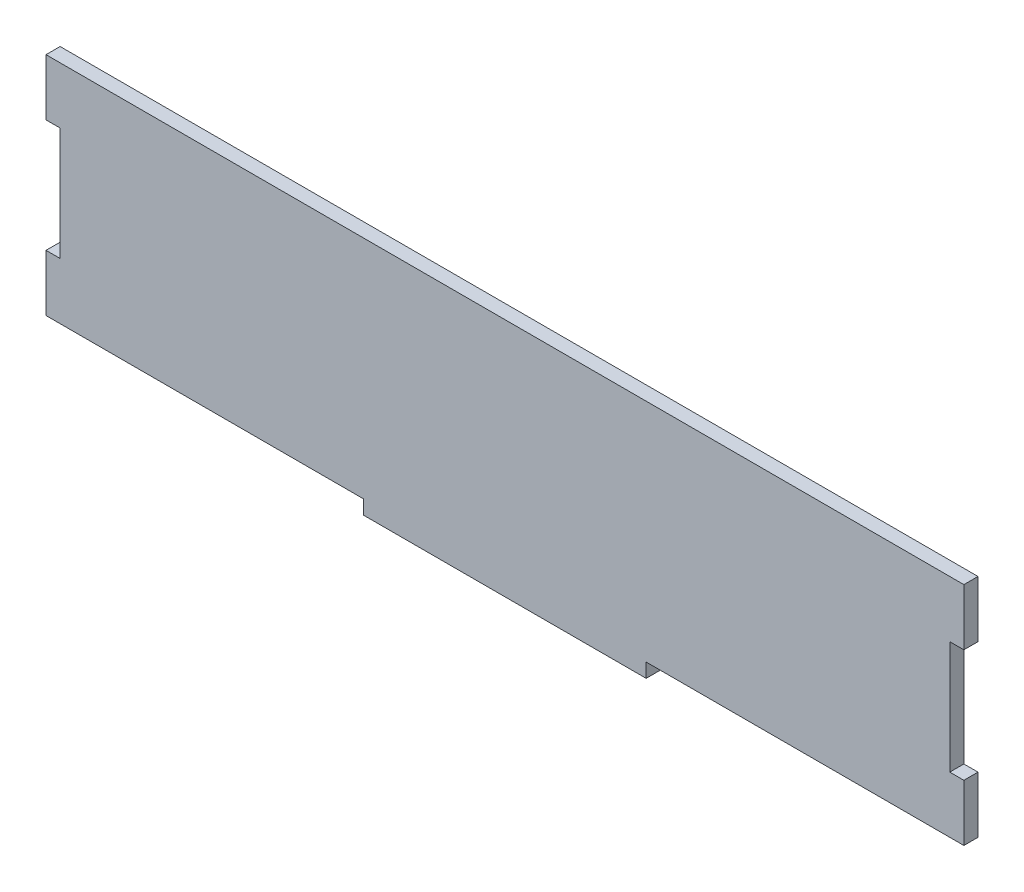
ISO-10303-21;
HEADER;
FILE_DESCRIPTION(('STEP AP214'),'2;1');
FILE_NAME('part.step','',(''),(''),'','','');
FILE_SCHEMA(('AUTOMOTIVE_DESIGN { 1 0 10303 214 1 1 1 1 }'));
ENDSEC;
DATA;
#1=APPLICATION_CONTEXT('core data for automotive mechanical design processes');
#2=APPLICATION_PROTOCOL_DEFINITION('international standard','automotive_design',2000,#1);
#3=PRODUCT_CONTEXT('',#1,'mechanical');
#4=PRODUCT('Part','Part','',(#3));
#5=PRODUCT_RELATED_PRODUCT_CATEGORY('part','',(#4));
#6=PRODUCT_DEFINITION_FORMATION('','',#4);
#7=PRODUCT_DEFINITION_CONTEXT('part definition',#1,'design');
#8=PRODUCT_DEFINITION('design','',#6,#7);
#9=PRODUCT_DEFINITION_SHAPE('','',#8);
#10=(LENGTH_UNIT() NAMED_UNIT(*) SI_UNIT(.MILLI.,.METRE.));
#11=(NAMED_UNIT(*) PLANE_ANGLE_UNIT() SI_UNIT($,.RADIAN.));
#12=(NAMED_UNIT(*) SI_UNIT($,.STERADIAN.) SOLID_ANGLE_UNIT());
#13=UNCERTAINTY_MEASURE_WITH_UNIT(LENGTH_MEASURE(1.E-05),#10,'distance_accuracy_value','');
#14=(GEOMETRIC_REPRESENTATION_CONTEXT(3) GLOBAL_UNCERTAINTY_ASSIGNED_CONTEXT((#13)) GLOBAL_UNIT_ASSIGNED_CONTEXT((#10,
#11,#12)) REPRESENTATION_CONTEXT('',''));
#15=CARTESIAN_POINT('',(0.,0.,0.));
#16=DIRECTION('',(0.,0.,1.));
#17=DIRECTION('',(1.,0.,0.));
#18=AXIS2_PLACEMENT_3D('',#15,#16,#17);
#19=CARTESIAN_POINT('',(0.,0.,5.));
#20=DIRECTION('',(1.,0.,0.));
#21=DIRECTION('',(0.,0.,-1.));
#22=AXIS2_PLACEMENT_3D('',#19,#20,#21);
#23=PLANE('',#22);
#24=DIRECTION('',(0.,-1.,0.));
#25=VECTOR('',#24,1.);
#26=CARTESIAN_POINT('',(0.,0.,5.));
#27=LINE('',#26,#25);
#28=CARTESIAN_POINT('',(0.,20.,5.));
#29=VERTEX_POINT('',#28);
#30=CARTESIAN_POINT('',(0.,0.,5.));
#31=VERTEX_POINT('',#30);
#32=EDGE_CURVE('E235',#29,#31,#27,.T.);
#33=ORIENTED_EDGE('',*,*,#32,.F.);
#34=DIRECTION('',(0.,0.,1.));
#35=VECTOR('',#34,1.);
#36=CARTESIAN_POINT('',(0.,20.,0.));
#37=LINE('',#36,#35);
#38=CARTESIAN_POINT('',(0.,20.,0.));
#39=VERTEX_POINT('',#38);
#40=EDGE_CURVE('E176',#39,#29,#37,.T.);
#41=ORIENTED_EDGE('',*,*,#40,.F.);
#42=DIRECTION('',(0.,-1.,0.));
#43=VECTOR('',#42,1.);
#44=CARTESIAN_POINT('',(0.,0.,0.));
#45=LINE('',#44,#43);
#46=CARTESIAN_POINT('',(0.,0.,0.));
#47=VERTEX_POINT('',#46);
#48=EDGE_CURVE('E166',#39,#47,#45,.T.);
#49=ORIENTED_EDGE('',*,*,#48,.T.);
#50=DIRECTION('',(0.,0.,-1.));
#51=VECTOR('',#50,1.);
#52=CARTESIAN_POINT('',(0.,0.,5.));
#53=LINE('',#52,#51);
#54=EDGE_CURVE('E11',#31,#47,#53,.T.);
#55=ORIENTED_EDGE('',*,*,#54,.F.);
#56=EDGE_LOOP('',(#33,#41,#49,#55));
#57=FACE_BOUND('',#56,.T.);
#58=ADVANCED_FACE('F33',(#57),#23,.F.);
#59=CARTESIAN_POINT('',(325.,0.,5.));
#60=DIRECTION('',(-1.,0.,0.));
#61=DIRECTION('',(0.,0.,1.));
#62=AXIS2_PLACEMENT_3D('',#59,#60,#61);
#63=PLANE('',#62);
#64=DIRECTION('',(0.,1.,0.));
#65=VECTOR('',#64,1.);
#66=CARTESIAN_POINT('',(325.,0.,0.));
#67=LINE('',#66,#65);
#68=CARTESIAN_POINT('',(325.,0.,0.));
#69=VERTEX_POINT('',#68);
#70=CARTESIAN_POINT('',(325.,20.,0.));
#71=VERTEX_POINT('',#70);
#72=EDGE_CURVE('E254',#69,#71,#67,.T.);
#73=ORIENTED_EDGE('',*,*,#72,.T.);
#74=DIRECTION('',(0.,0.,1.));
#75=VECTOR('',#74,1.);
#76=CARTESIAN_POINT('',(325.,20.,0.));
#77=LINE('',#76,#75);
#78=CARTESIAN_POINT('',(325.,20.,5.));
#79=VERTEX_POINT('',#78);
#80=EDGE_CURVE('E174',#71,#79,#77,.T.);
#81=ORIENTED_EDGE('',*,*,#80,.T.);
#82=DIRECTION('',(0.,1.,0.));
#83=VECTOR('',#82,1.);
#84=CARTESIAN_POINT('',(325.,0.,5.));
#85=LINE('',#84,#83);
#86=CARTESIAN_POINT('',(325.,0.,5.));
#87=VERTEX_POINT('',#86);
#88=EDGE_CURVE('E240',#87,#79,#85,.T.);
#89=ORIENTED_EDGE('',*,*,#88,.F.);
#90=DIRECTION('',(0.,0.,-1.));
#91=VECTOR('',#90,1.);
#92=CARTESIAN_POINT('',(325.,0.,5.));
#93=LINE('',#92,#91);
#94=EDGE_CURVE('E41',#87,#69,#93,.T.);
#95=ORIENTED_EDGE('',*,*,#94,.T.);
#96=EDGE_LOOP('',(#73,#81,#89,#95));
#97=FACE_BOUND('',#96,.T.);
#98=ADVANCED_FACE('F268',(#97),#63,.F.);
#99=CARTESIAN_POINT('',(0.,0.,5.));
#100=DIRECTION('',(0.,1.,0.));
#101=DIRECTION('',(0.,0.,1.));
#102=AXIS2_PLACEMENT_3D('',#99,#100,#101);
#103=PLANE('',#102);
#104=DIRECTION('',(0.,0.,1.));
#105=VECTOR('',#104,1.);
#106=CARTESIAN_POINT('',(212.5,0.,0.));
#107=LINE('',#106,#105);
#108=CARTESIAN_POINT('',(212.5,0.,0.));
#109=VERTEX_POINT('',#108);
#110=CARTESIAN_POINT('',(212.5,0.,5.));
#111=VERTEX_POINT('',#110);
#112=EDGE_CURVE('E215',#109,#111,#107,.T.);
#113=ORIENTED_EDGE('',*,*,#112,.F.);
#114=DIRECTION('',(1.,0.,0.));
#115=VECTOR('',#114,1.);
#116=CARTESIAN_POINT('',(0.,0.,0.));
#117=LINE('',#116,#115);
#118=EDGE_CURVE('E249',#109,#69,#117,.T.);
#119=ORIENTED_EDGE('',*,*,#118,.T.);
#120=ORIENTED_EDGE('',*,*,#94,.F.);
#121=DIRECTION('',(1.,0.,0.));
#122=VECTOR('',#121,1.);
#123=CARTESIAN_POINT('',(0.,0.,5.));
#124=LINE('',#123,#122);
#125=EDGE_CURVE('E234',#111,#87,#124,.T.);
#126=ORIENTED_EDGE('',*,*,#125,.F.);
#127=EDGE_LOOP('',(#113,#119,#120,#126));
#128=FACE_BOUND('',#127,.T.);
#129=ADVANCED_FACE('F282',(#128),#103,.F.);
#130=CARTESIAN_POINT('',(0.,80.,0.));
#131=VERTEX_POINT('',#130);
#132=CARTESIAN_POINT('',(0.,60.,0.));
#133=VERTEX_POINT('',#132);
#134=EDGE_CURVE('E246',#131,#133,#45,.T.);
#135=ORIENTED_EDGE('',*,*,#134,.T.);
#136=DIRECTION('',(0.,0.,1.));
#137=VECTOR('',#136,1.);
#138=CARTESIAN_POINT('',(0.,60.,0.));
#139=LINE('',#138,#137);
#140=CARTESIAN_POINT('',(0.,60.,5.));
#141=VERTEX_POINT('',#140);
#142=EDGE_CURVE('E179',#133,#141,#139,.T.);
#143=ORIENTED_EDGE('',*,*,#142,.T.);
#144=CARTESIAN_POINT('',(0.,80.,5.));
#145=VERTEX_POINT('',#144);
#146=EDGE_CURVE('E231',#145,#141,#27,.T.);
#147=ORIENTED_EDGE('',*,*,#146,.F.);
#148=DIRECTION('',(0.,0.,-1.));
#149=VECTOR('',#148,1.);
#150=CARTESIAN_POINT('',(0.,80.,5.));
#151=LINE('',#150,#149);
#152=EDGE_CURVE('E245',#145,#131,#151,.T.);
#153=ORIENTED_EDGE('',*,*,#152,.T.);
#154=EDGE_LOOP('',(#135,#143,#147,#153));
#155=FACE_BOUND('',#154,.T.);
#156=ADVANCED_FACE('F35',(#155),#23,.F.);
#157=CARTESIAN_POINT('',(112.5,0.,0.));
#158=VERTEX_POINT('',#157);
#159=EDGE_CURVE('E250',#47,#158,#117,.T.);
#160=ORIENTED_EDGE('',*,*,#159,.T.);
#161=DIRECTION('',(0.,0.,1.));
#162=VECTOR('',#161,1.);
#163=CARTESIAN_POINT('',(112.5,0.,0.));
#164=LINE('',#163,#162);
#165=CARTESIAN_POINT('',(112.5,0.,5.));
#166=VERTEX_POINT('',#165);
#167=EDGE_CURVE('E227',#158,#166,#164,.T.);
#168=ORIENTED_EDGE('',*,*,#167,.T.);
#169=EDGE_CURVE('E236',#31,#166,#124,.T.);
#170=ORIENTED_EDGE('',*,*,#169,.F.);
#171=ORIENTED_EDGE('',*,*,#54,.T.);
#172=EDGE_LOOP('',(#160,#168,#170,#171));
#173=FACE_BOUND('',#172,.T.);
#174=ADVANCED_FACE('F293',(#173),#103,.F.);
#175=CARTESIAN_POINT('',(325.,60.,5.));
#176=VERTEX_POINT('',#175);
#177=CARTESIAN_POINT('',(325.,80.,5.));
#178=VERTEX_POINT('',#177);
#179=EDGE_CURVE('E239',#176,#178,#85,.T.);
#180=ORIENTED_EDGE('',*,*,#179,.F.);
#181=DIRECTION('',(0.,0.,1.));
#182=VECTOR('',#181,1.);
#183=CARTESIAN_POINT('',(325.,60.,0.));
#184=LINE('',#183,#182);
#185=CARTESIAN_POINT('',(325.,60.,0.));
#186=VERTEX_POINT('',#185);
#187=EDGE_CURVE('E191',#186,#176,#184,.T.);
#188=ORIENTED_EDGE('',*,*,#187,.F.);
#189=CARTESIAN_POINT('',(325.,80.,0.));
#190=VERTEX_POINT('',#189);
#191=EDGE_CURVE('E253',#186,#190,#67,.T.);
#192=ORIENTED_EDGE('',*,*,#191,.T.);
#193=DIRECTION('',(0.,0.,-1.));
#194=VECTOR('',#193,1.);
#195=CARTESIAN_POINT('',(325.,80.,5.));
#196=LINE('',#195,#194);
#197=EDGE_CURVE('E261',#178,#190,#196,.T.);
#198=ORIENTED_EDGE('',*,*,#197,.F.);
#199=EDGE_LOOP('',(#180,#188,#192,#198));
#200=FACE_BOUND('',#199,.T.);
#201=ADVANCED_FACE('F312',(#200),#63,.F.);
#202=CARTESIAN_POINT('',(0.,80.,5.));
#203=DIRECTION('',(0.,-1.,0.));
#204=DIRECTION('',(0.,0.,-1.));
#205=AXIS2_PLACEMENT_3D('',#202,#203,#204);
#206=PLANE('',#205);
#207=DIRECTION('',(-1.,0.,0.));
#208=VECTOR('',#207,1.);
#209=CARTESIAN_POINT('',(0.,80.,0.));
#210=LINE('',#209,#208);
#211=EDGE_CURVE('E257',#190,#131,#210,.T.);
#212=ORIENTED_EDGE('',*,*,#211,.T.);
#213=ORIENTED_EDGE('',*,*,#152,.F.);
#214=DIRECTION('',(-1.,0.,0.));
#215=VECTOR('',#214,1.);
#216=CARTESIAN_POINT('',(0.,80.,5.));
#217=LINE('',#216,#215);
#218=EDGE_CURVE('E243',#178,#145,#217,.T.);
#219=ORIENTED_EDGE('',*,*,#218,.F.);
#220=ORIENTED_EDGE('',*,*,#197,.T.);
#221=EDGE_LOOP('',(#212,#213,#219,#220));
#222=FACE_BOUND('',#221,.T.);
#223=ADVANCED_FACE('F307',(#222),#206,.F.);
#224=CARTESIAN_POINT('',(0.,0.,5.));
#225=DIRECTION('',(0.,0.,-1.));
#226=DIRECTION('',(-1.,0.,0.));
#227=AXIS2_PLACEMENT_3D('',#224,#225,#226);
#228=PLANE('',#227);
#229=DIRECTION('',(0.,1.,0.));
#230=VECTOR('',#229,1.);
#231=CARTESIAN_POINT('',(4.99999999999999,60.,5.));
#232=LINE('',#231,#230);
#233=CARTESIAN_POINT('',(5.,20.,5.));
#234=VERTEX_POINT('',#233);
#235=CARTESIAN_POINT('',(4.99999999999999,60.,5.));
#236=VERTEX_POINT('',#235);
#237=EDGE_CURVE('E169',#234,#236,#232,.T.);
#238=ORIENTED_EDGE('',*,*,#237,.F.);
#239=DIRECTION('',(1.,0.,0.));
#240=VECTOR('',#239,1.);
#241=CARTESIAN_POINT('',(0.,20.,5.));
#242=LINE('',#241,#240);
#243=EDGE_CURVE('E152',#29,#234,#242,.T.);
#244=ORIENTED_EDGE('',*,*,#243,.F.);
#245=ORIENTED_EDGE('',*,*,#32,.T.);
#246=ORIENTED_EDGE('',*,*,#169,.T.);
#247=DIRECTION('',(0.,-1.,0.));
#248=VECTOR('',#247,1.);
#249=CARTESIAN_POINT('',(112.5,0.,5.));
#250=LINE('',#249,#248);
#251=CARTESIAN_POINT('',(112.5,-4.99999999999999,5.));
#252=VERTEX_POINT('',#251);
#253=EDGE_CURVE('E218',#166,#252,#250,.T.);
#254=ORIENTED_EDGE('',*,*,#253,.T.);
#255=DIRECTION('',(1.,0.,0.));
#256=VECTOR('',#255,1.);
#257=CARTESIAN_POINT('',(112.5,-4.99999999999999,5.));
#258=LINE('',#257,#256);
#259=CARTESIAN_POINT('',(212.5,-4.99999999999998,5.));
#260=VERTEX_POINT('',#259);
#261=EDGE_CURVE('E209',#252,#260,#258,.T.);
#262=ORIENTED_EDGE('',*,*,#261,.T.);
#263=DIRECTION('',(0.,1.,0.));
#264=VECTOR('',#263,1.);
#265=CARTESIAN_POINT('',(212.5,0.,5.));
#266=LINE('',#265,#264);
#267=EDGE_CURVE('E178',#260,#111,#266,.T.);
#268=ORIENTED_EDGE('',*,*,#267,.T.);
#269=ORIENTED_EDGE('',*,*,#125,.T.);
#270=ORIENTED_EDGE('',*,*,#88,.T.);
#271=DIRECTION('',(1.,0.,0.));
#272=VECTOR('',#271,1.);
#273=CARTESIAN_POINT('',(325.,20.,5.));
#274=LINE('',#273,#272);
#275=CARTESIAN_POINT('',(320.,20.,5.));
#276=VERTEX_POINT('',#275);
#277=EDGE_CURVE('E186',#276,#79,#274,.T.);
#278=ORIENTED_EDGE('',*,*,#277,.F.);
#279=DIRECTION('',(0.,-1.,0.));
#280=VECTOR('',#279,1.);
#281=CARTESIAN_POINT('',(320.,60.,5.));
#282=LINE('',#281,#280);
#283=CARTESIAN_POINT('',(320.,60.,5.));
#284=VERTEX_POINT('',#283);
#285=EDGE_CURVE('E195',#284,#276,#282,.T.);
#286=ORIENTED_EDGE('',*,*,#285,.F.);
#287=DIRECTION('',(-1.,0.,0.));
#288=VECTOR('',#287,1.);
#289=CARTESIAN_POINT('',(325.,60.,5.));
#290=LINE('',#289,#288);
#291=EDGE_CURVE('E192',#176,#284,#290,.T.);
#292=ORIENTED_EDGE('',*,*,#291,.F.);
#293=ORIENTED_EDGE('',*,*,#179,.T.);
#294=ORIENTED_EDGE('',*,*,#218,.T.);
#295=ORIENTED_EDGE('',*,*,#146,.T.);
#296=DIRECTION('',(-1.,0.,0.));
#297=VECTOR('',#296,1.);
#298=CARTESIAN_POINT('',(0.,60.,5.));
#299=LINE('',#298,#297);
#300=EDGE_CURVE('E167',#236,#141,#299,.T.);
#301=ORIENTED_EDGE('',*,*,#300,.F.);
#302=EDGE_LOOP('',(#238,#244,#245,#246,#254,#262,#268,#269,#270,#278,#286,#292,#293,#294,#295,#301));
#303=FACE_BOUND('',#302,.T.);
#304=ADVANCED_FACE('F278',(#303),#228,.F.);
#305=CARTESIAN_POINT('',(0.,0.,0.));
#306=DIRECTION('',(0.,0.,-1.));
#307=DIRECTION('',(-1.,0.,0.));
#308=AXIS2_PLACEMENT_3D('',#305,#306,#307);
#309=PLANE('',#308);
#310=DIRECTION('',(1.,0.,0.));
#311=VECTOR('',#310,1.);
#312=CARTESIAN_POINT('',(0.,20.,0.));
#313=LINE('',#312,#311);
#314=CARTESIAN_POINT('',(5.,20.,0.));
#315=VERTEX_POINT('',#314);
#316=EDGE_CURVE('E149',#39,#315,#313,.T.);
#317=ORIENTED_EDGE('',*,*,#316,.T.);
#318=DIRECTION('',(0.,1.,0.));
#319=VECTOR('',#318,1.);
#320=CARTESIAN_POINT('',(4.99999999999999,60.,0.));
#321=LINE('',#320,#319);
#322=CARTESIAN_POINT('',(4.99999999999999,60.,0.));
#323=VERTEX_POINT('',#322);
#324=EDGE_CURVE('E159',#315,#323,#321,.T.);
#325=ORIENTED_EDGE('',*,*,#324,.T.);
#326=DIRECTION('',(-1.,0.,0.));
#327=VECTOR('',#326,1.);
#328=CARTESIAN_POINT('',(0.,60.,0.));
#329=LINE('',#328,#327);
#330=EDGE_CURVE('E48',#323,#133,#329,.T.);
#331=ORIENTED_EDGE('',*,*,#330,.T.);
#332=ORIENTED_EDGE('',*,*,#134,.F.);
#333=ORIENTED_EDGE('',*,*,#211,.F.);
#334=ORIENTED_EDGE('',*,*,#191,.F.);
#335=DIRECTION('',(-1.,0.,0.));
#336=VECTOR('',#335,1.);
#337=CARTESIAN_POINT('',(325.,60.,0.));
#338=LINE('',#337,#336);
#339=CARTESIAN_POINT('',(320.,60.,0.));
#340=VERTEX_POINT('',#339);
#341=EDGE_CURVE('E183',#186,#340,#338,.T.);
#342=ORIENTED_EDGE('',*,*,#341,.T.);
#343=DIRECTION('',(0.,-1.,0.));
#344=VECTOR('',#343,1.);
#345=CARTESIAN_POINT('',(320.,60.,0.));
#346=LINE('',#345,#344);
#347=CARTESIAN_POINT('',(320.,20.,0.));
#348=VERTEX_POINT('',#347);
#349=EDGE_CURVE('E56',#340,#348,#346,.T.);
#350=ORIENTED_EDGE('',*,*,#349,.T.);
#351=DIRECTION('',(1.,0.,0.));
#352=VECTOR('',#351,1.);
#353=CARTESIAN_POINT('',(325.,20.,0.));
#354=LINE('',#353,#352);
#355=EDGE_CURVE('E188',#348,#71,#354,.T.);
#356=ORIENTED_EDGE('',*,*,#355,.T.);
#357=ORIENTED_EDGE('',*,*,#72,.F.);
#358=ORIENTED_EDGE('',*,*,#118,.F.);
#359=DIRECTION('',(0.,1.,0.));
#360=VECTOR('',#359,1.);
#361=CARTESIAN_POINT('',(212.5,0.,0.));
#362=LINE('',#361,#360);
#363=CARTESIAN_POINT('',(212.5,-4.99999999999998,0.));
#364=VERTEX_POINT('',#363);
#365=EDGE_CURVE('E206',#364,#109,#362,.T.);
#366=ORIENTED_EDGE('',*,*,#365,.F.);
#367=DIRECTION('',(1.,0.,0.));
#368=VECTOR('',#367,1.);
#369=CARTESIAN_POINT('',(112.5,-4.99999999999999,0.));
#370=LINE('',#369,#368);
#371=CARTESIAN_POINT('',(112.5,-4.99999999999999,0.));
#372=VERTEX_POINT('',#371);
#373=EDGE_CURVE('E212',#372,#364,#370,.T.);
#374=ORIENTED_EDGE('',*,*,#373,.F.);
#375=DIRECTION('',(0.,-1.,0.));
#376=VECTOR('',#375,1.);
#377=CARTESIAN_POINT('',(112.5,0.,0.));
#378=LINE('',#377,#376);
#379=EDGE_CURVE('E208',#158,#372,#378,.T.);
#380=ORIENTED_EDGE('',*,*,#379,.F.);
#381=ORIENTED_EDGE('',*,*,#159,.F.);
#382=ORIENTED_EDGE('',*,*,#48,.F.);
#383=EDGE_LOOP('',(#317,#325,#331,#332,#333,#334,#342,#350,#356,#357,#358,#366,#374,#380,#381,#382));
#384=FACE_BOUND('',#383,.T.);
#385=ADVANCED_FACE('F164',(#384),#309,.T.);
#386=CARTESIAN_POINT('',(212.5,0.,0.));
#387=DIRECTION('',(1.,0.,0.));
#388=DIRECTION('',(0.,1.,0.));
#389=AXIS2_PLACEMENT_3D('',#386,#387,#388);
#390=PLANE('',#389);
#391=ORIENTED_EDGE('',*,*,#267,.F.);
#392=DIRECTION('',(0.,0.,1.));
#393=VECTOR('',#392,1.);
#394=CARTESIAN_POINT('',(212.5,-4.99999999999998,0.));
#395=LINE('',#394,#393);
#396=EDGE_CURVE('E223',#364,#260,#395,.T.);
#397=ORIENTED_EDGE('',*,*,#396,.F.);
#398=ORIENTED_EDGE('',*,*,#365,.T.);
#399=ORIENTED_EDGE('',*,*,#112,.T.);
#400=EDGE_LOOP('',(#391,#397,#398,#399));
#401=FACE_BOUND('',#400,.T.);
#402=ADVANCED_FACE('F284',(#401),#390,.T.);
#403=CARTESIAN_POINT('',(112.5,-4.99999999999999,0.));
#404=DIRECTION('',(0.,-1.,0.));
#405=DIRECTION('',(1.,0.,0.));
#406=AXIS2_PLACEMENT_3D('',#403,#404,#405);
#407=PLANE('',#406);
#408=ORIENTED_EDGE('',*,*,#261,.F.);
#409=DIRECTION('',(0.,0.,1.));
#410=VECTOR('',#409,1.);
#411=CARTESIAN_POINT('',(112.5,-4.99999999999999,0.));
#412=LINE('',#411,#410);
#413=EDGE_CURVE('E225',#372,#252,#412,.T.);
#414=ORIENTED_EDGE('',*,*,#413,.F.);
#415=ORIENTED_EDGE('',*,*,#373,.T.);
#416=ORIENTED_EDGE('',*,*,#396,.T.);
#417=EDGE_LOOP('',(#408,#414,#415,#416));
#418=FACE_BOUND('',#417,.T.);
#419=ADVANCED_FACE('F289',(#418),#407,.T.);
#420=CARTESIAN_POINT('',(112.5,0.,0.));
#421=DIRECTION('',(-1.,0.,0.));
#422=DIRECTION('',(0.,0.,1.));
#423=AXIS2_PLACEMENT_3D('',#420,#421,#422);
#424=PLANE('',#423);
#425=ORIENTED_EDGE('',*,*,#253,.F.);
#426=ORIENTED_EDGE('',*,*,#167,.F.);
#427=ORIENTED_EDGE('',*,*,#379,.T.);
#428=ORIENTED_EDGE('',*,*,#413,.T.);
#429=EDGE_LOOP('',(#425,#426,#427,#428));
#430=FACE_BOUND('',#429,.T.);
#431=ADVANCED_FACE('F291',(#430),#424,.T.);
#432=CARTESIAN_POINT('',(325.,20.,0.));
#433=DIRECTION('',(0.,-1.,0.));
#434=DIRECTION('',(0.,0.,-1.));
#435=AXIS2_PLACEMENT_3D('',#432,#433,#434);
#436=PLANE('',#435);
#437=ORIENTED_EDGE('',*,*,#277,.T.);
#438=ORIENTED_EDGE('',*,*,#80,.F.);
#439=ORIENTED_EDGE('',*,*,#355,.F.);
#440=DIRECTION('',(0.,0.,1.));
#441=VECTOR('',#440,1.);
#442=CARTESIAN_POINT('',(320.,20.,0.));
#443=LINE('',#442,#441);
#444=EDGE_CURVE('E201',#348,#276,#443,.T.);
#445=ORIENTED_EDGE('',*,*,#444,.T.);
#446=EDGE_LOOP('',(#437,#438,#439,#445));
#447=FACE_BOUND('',#446,.T.);
#448=ADVANCED_FACE('F275',(#447),#436,.F.);
#449=CARTESIAN_POINT('',(320.,60.,0.));
#450=DIRECTION('',(-1.,0.,0.));
#451=DIRECTION('',(0.,0.,1.));
#452=AXIS2_PLACEMENT_3D('',#449,#450,#451);
#453=PLANE('',#452);
#454=ORIENTED_EDGE('',*,*,#285,.T.);
#455=ORIENTED_EDGE('',*,*,#444,.F.);
#456=ORIENTED_EDGE('',*,*,#349,.F.);
#457=DIRECTION('',(0.,0.,1.));
#458=VECTOR('',#457,1.);
#459=CARTESIAN_POINT('',(320.,60.,0.));
#460=LINE('',#459,#458);
#461=EDGE_CURVE('E203',#340,#284,#460,.T.);
#462=ORIENTED_EDGE('',*,*,#461,.T.);
#463=EDGE_LOOP('',(#454,#455,#456,#462));
#464=FACE_BOUND('',#463,.T.);
#465=ADVANCED_FACE('F317',(#464),#453,.F.);
#466=CARTESIAN_POINT('',(325.,60.,0.));
#467=DIRECTION('',(0.,1.,0.));
#468=DIRECTION('',(-1.,0.,0.));
#469=AXIS2_PLACEMENT_3D('',#466,#467,#468);
#470=PLANE('',#469);
#471=ORIENTED_EDGE('',*,*,#291,.T.);
#472=ORIENTED_EDGE('',*,*,#461,.F.);
#473=ORIENTED_EDGE('',*,*,#341,.F.);
#474=ORIENTED_EDGE('',*,*,#187,.T.);
#475=EDGE_LOOP('',(#471,#472,#473,#474));
#476=FACE_BOUND('',#475,.T.);
#477=ADVANCED_FACE('F316',(#476),#470,.F.);
#478=CARTESIAN_POINT('',(0.,20.,0.));
#479=DIRECTION('',(0.,-1.,0.));
#480=DIRECTION('',(0.,0.,-1.));
#481=AXIS2_PLACEMENT_3D('',#478,#479,#480);
#482=PLANE('',#481);
#483=ORIENTED_EDGE('',*,*,#243,.T.);
#484=DIRECTION('',(0.,0.,1.));
#485=VECTOR('',#484,1.);
#486=CARTESIAN_POINT('',(5.,20.,0.));
#487=LINE('',#486,#485);
#488=EDGE_CURVE('E145',#315,#234,#487,.T.);
#489=ORIENTED_EDGE('',*,*,#488,.F.);
#490=ORIENTED_EDGE('',*,*,#316,.F.);
#491=ORIENTED_EDGE('',*,*,#40,.T.);
#492=EDGE_LOOP('',(#483,#489,#490,#491));
#493=FACE_BOUND('',#492,.T.);
#494=ADVANCED_FACE('F147',(#493),#482,.F.);
#495=CARTESIAN_POINT('',(0.,60.,0.));
#496=DIRECTION('',(0.,1.,0.));
#497=DIRECTION('',(-1.,0.,0.));
#498=AXIS2_PLACEMENT_3D('',#495,#496,#497);
#499=PLANE('',#498);
#500=ORIENTED_EDGE('',*,*,#300,.T.);
#501=ORIENTED_EDGE('',*,*,#142,.F.);
#502=ORIENTED_EDGE('',*,*,#330,.F.);
#503=DIRECTION('',(0.,0.,1.));
#504=VECTOR('',#503,1.);
#505=CARTESIAN_POINT('',(4.99999999999999,60.,0.));
#506=LINE('',#505,#504);
#507=EDGE_CURVE('E156',#323,#236,#506,.T.);
#508=ORIENTED_EDGE('',*,*,#507,.T.);
#509=EDGE_LOOP('',(#500,#501,#502,#508));
#510=FACE_BOUND('',#509,.T.);
#511=ADVANCED_FACE('F300',(#510),#499,.F.);
#512=CARTESIAN_POINT('',(4.99999999999999,60.,0.));
#513=DIRECTION('',(1.,0.,0.));
#514=DIRECTION('',(0.,1.,0.));
#515=AXIS2_PLACEMENT_3D('',#512,#513,#514);
#516=PLANE('',#515);
#517=ORIENTED_EDGE('',*,*,#237,.T.);
#518=ORIENTED_EDGE('',*,*,#507,.F.);
#519=ORIENTED_EDGE('',*,*,#324,.F.);
#520=ORIENTED_EDGE('',*,*,#488,.T.);
#521=EDGE_LOOP('',(#517,#518,#519,#520));
#522=FACE_BOUND('',#521,.T.);
#523=ADVANCED_FACE('F160',(#522),#516,.F.);
#524=CLOSED_SHELL('',(#58,#98,#129,#156,#174,#201,#223,#304,#385,#402,#419,#431,#448,#465,#477,
#494,#511,#523));
#525=MANIFOLD_SOLID_BREP('B2',#524);
#526=ADVANCED_BREP_SHAPE_REPRESENTATION('',(#18,#525),#14);
#527=SHAPE_DEFINITION_REPRESENTATION(#9,#526);
ENDSEC;
END-ISO-10303-21;
